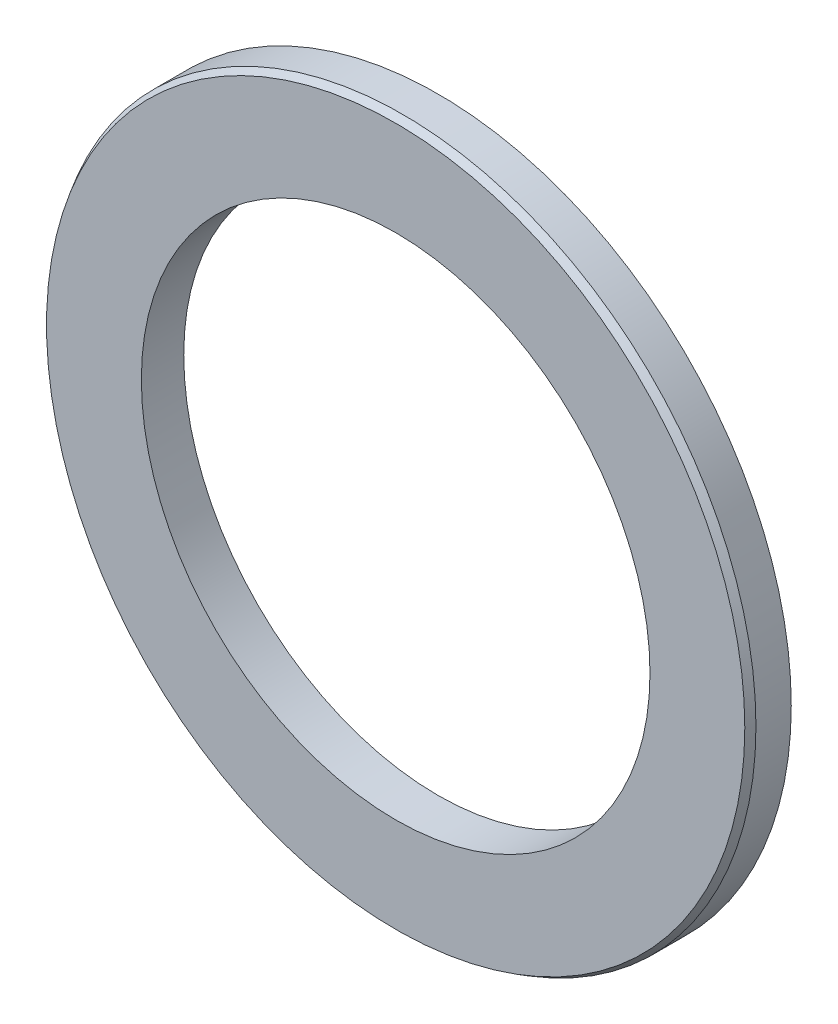
ISO-10303-21;
HEADER;
FILE_DESCRIPTION(('STEP AP214'),'2;1');
FILE_NAME('part.step','',(''),(''),'','','');
FILE_SCHEMA(('AUTOMOTIVE_DESIGN { 1 0 10303 214 1 1 1 1 }'));
ENDSEC;
DATA;
#1=APPLICATION_CONTEXT('core data for automotive mechanical design processes');
#2=APPLICATION_PROTOCOL_DEFINITION('international standard','automotive_design',2000,#1);
#3=PRODUCT_CONTEXT('',#1,'mechanical');
#4=PRODUCT('Part','Part','',(#3));
#5=PRODUCT_RELATED_PRODUCT_CATEGORY('part','',(#4));
#6=PRODUCT_DEFINITION_FORMATION('','',#4);
#7=PRODUCT_DEFINITION_CONTEXT('part definition',#1,'design');
#8=PRODUCT_DEFINITION('design','',#6,#7);
#9=PRODUCT_DEFINITION_SHAPE('','',#8);
#10=(LENGTH_UNIT() NAMED_UNIT(*) SI_UNIT(.MILLI.,.METRE.));
#11=(NAMED_UNIT(*) PLANE_ANGLE_UNIT() SI_UNIT($,.RADIAN.));
#12=(NAMED_UNIT(*) SI_UNIT($,.STERADIAN.) SOLID_ANGLE_UNIT());
#13=UNCERTAINTY_MEASURE_WITH_UNIT(LENGTH_MEASURE(1.E-05),#10,'distance_accuracy_value','');
#14=(GEOMETRIC_REPRESENTATION_CONTEXT(3) GLOBAL_UNCERTAINTY_ASSIGNED_CONTEXT((#13)) GLOBAL_UNIT_ASSIGNED_CONTEXT((#10,
#11,#12)) REPRESENTATION_CONTEXT('',''));
#15=CARTESIAN_POINT('',(0.,0.,0.));
#16=DIRECTION('',(0.,0.,1.));
#17=DIRECTION('',(1.,0.,0.));
#18=AXIS2_PLACEMENT_3D('',#15,#16,#17);
#19=CARTESIAN_POINT('',(0.,0.,3.));
#20=DIRECTION('',(0.,0.,-1.));
#21=DIRECTION('',(-1.,0.,0.));
#22=AXIS2_PLACEMENT_3D('',#19,#20,#21);
#23=CYLINDRICAL_SURFACE('',#22,25.);
#24=CARTESIAN_POINT('',(0.,0.,2.5));
#25=DIRECTION('',(0.,0.,1.));
#26=DIRECTION('',(1.,0.,0.));
#27=AXIS2_PLACEMENT_3D('',#24,#25,#26);
#28=CIRCLE('',#27,25.);
#29=CARTESIAN_POINT('',(25.,0.,2.5));
#30=VERTEX_POINT('',#29);
#31=EDGE_CURVE('E10',#30,#30,#28,.F.);
#32=ORIENTED_EDGE('',*,*,#31,.T.);
#33=EDGE_LOOP('',(#32));
#34=FACE_BOUND('',#33,.T.);
#35=CARTESIAN_POINT('',(0.,0.,0.));
#36=DIRECTION('',(0.,0.,1.));
#37=DIRECTION('',(1.,0.,0.));
#38=AXIS2_PLACEMENT_3D('',#35,#36,#37);
#39=CIRCLE('',#38,25.);
#40=CARTESIAN_POINT('',(25.,0.,0.));
#41=VERTEX_POINT('',#40);
#42=EDGE_CURVE('E42',#41,#41,#39,.T.);
#43=ORIENTED_EDGE('',*,*,#42,.T.);
#44=EDGE_LOOP('',(#43));
#45=FACE_BOUND('',#44,.T.);
#46=ADVANCED_FACE('F32',(#34,#45),#23,.T.);
#47=CARTESIAN_POINT('',(0.,0.,3.));
#48=DIRECTION('',(0.,0.,1.));
#49=DIRECTION('',(1.,0.,0.));
#50=AXIS2_PLACEMENT_3D('',#47,#48,#49);
#51=PLANE('',#50);
#52=CARTESIAN_POINT('',(0.,0.,3.));
#53=DIRECTION('',(0.,0.,1.));
#54=DIRECTION('',(1.,0.,0.));
#55=AXIS2_PLACEMENT_3D('',#52,#53,#54);
#56=CIRCLE('',#55,24.7113248654052);
#57=CARTESIAN_POINT('',(24.7113248654052,0.,3.));
#58=VERTEX_POINT('',#57);
#59=EDGE_CURVE('E38',#58,#58,#56,.T.);
#60=ORIENTED_EDGE('',*,*,#59,.T.);
#61=EDGE_LOOP('',(#60));
#62=FACE_BOUND('',#61,.T.);
#63=CARTESIAN_POINT('',(0.,0.,3.));
#64=DIRECTION('',(0.,0.,1.));
#65=DIRECTION('',(1.,0.,0.));
#66=AXIS2_PLACEMENT_3D('',#63,#64,#65);
#67=CIRCLE('',#66,18.);
#68=CARTESIAN_POINT('',(18.,0.,3.));
#69=VERTEX_POINT('',#68);
#70=EDGE_CURVE('E51',#69,#69,#67,.T.);
#71=ORIENTED_EDGE('',*,*,#70,.F.);
#72=EDGE_LOOP('',(#71));
#73=FACE_BOUND('',#72,.T.);
#74=ADVANCED_FACE('F57',(#62,#73),#51,.T.);
#75=CARTESIAN_POINT('',(0.,0.,0.));
#76=DIRECTION('',(0.,0.,1.));
#77=DIRECTION('',(1.,0.,0.));
#78=AXIS2_PLACEMENT_3D('',#75,#76,#77);
#79=PLANE('',#78);
#80=CARTESIAN_POINT('',(0.,0.,0.));
#81=DIRECTION('',(0.,0.,1.));
#82=DIRECTION('',(1.,0.,0.));
#83=AXIS2_PLACEMENT_3D('',#80,#81,#82);
#84=CIRCLE('',#83,18.);
#85=CARTESIAN_POINT('',(18.,0.,0.));
#86=VERTEX_POINT('',#85);
#87=EDGE_CURVE('E46',#86,#86,#84,.T.);
#88=ORIENTED_EDGE('',*,*,#87,.T.);
#89=EDGE_LOOP('',(#88));
#90=FACE_BOUND('',#89,.T.);
#91=ORIENTED_EDGE('',*,*,#42,.F.);
#92=EDGE_LOOP('',(#91));
#93=FACE_BOUND('',#92,.T.);
#94=ADVANCED_FACE('F59',(#90,#93),#79,.F.);
#95=CARTESIAN_POINT('',(0.,0.,0.));
#96=DIRECTION('',(0.,0.,1.));
#97=DIRECTION('',(1.,0.,0.));
#98=AXIS2_PLACEMENT_3D('',#95,#96,#97);
#99=CYLINDRICAL_SURFACE('',#98,18.);
#100=ORIENTED_EDGE('',*,*,#87,.F.);
#101=EDGE_LOOP('',(#100));
#102=FACE_BOUND('',#101,.T.);
#103=ORIENTED_EDGE('',*,*,#70,.T.);
#104=EDGE_LOOP('',(#103));
#105=FACE_BOUND('',#104,.T.);
#106=ADVANCED_FACE('F55',(#102,#105),#99,.F.);
#107=CARTESIAN_POINT('',(0.,0.,3.));
#108=DIRECTION('',(0.,0.,-1.));
#109=DIRECTION('',(-1.,0.,0.));
#110=AXIS2_PLACEMENT_3D('',#107,#108,#109);
#111=CONICAL_SURFACE('',#110,24.7113248654052,0.523598775598296);
#112=ORIENTED_EDGE('',*,*,#31,.F.);
#113=EDGE_LOOP('',(#112));
#114=FACE_BOUND('',#113,.T.);
#115=ORIENTED_EDGE('',*,*,#59,.F.);
#116=EDGE_LOOP('',(#115));
#117=FACE_BOUND('',#116,.T.);
#118=ADVANCED_FACE('F69',(#114,#117),#111,.T.);
#119=CLOSED_SHELL('',(#46,#74,#94,#106,#118));
#120=MANIFOLD_SOLID_BREP('B2',#119);
#121=ADVANCED_BREP_SHAPE_REPRESENTATION('',(#18,#120),#14);
#122=SHAPE_DEFINITION_REPRESENTATION(#9,#121);
ENDSEC;
END-ISO-10303-21;
